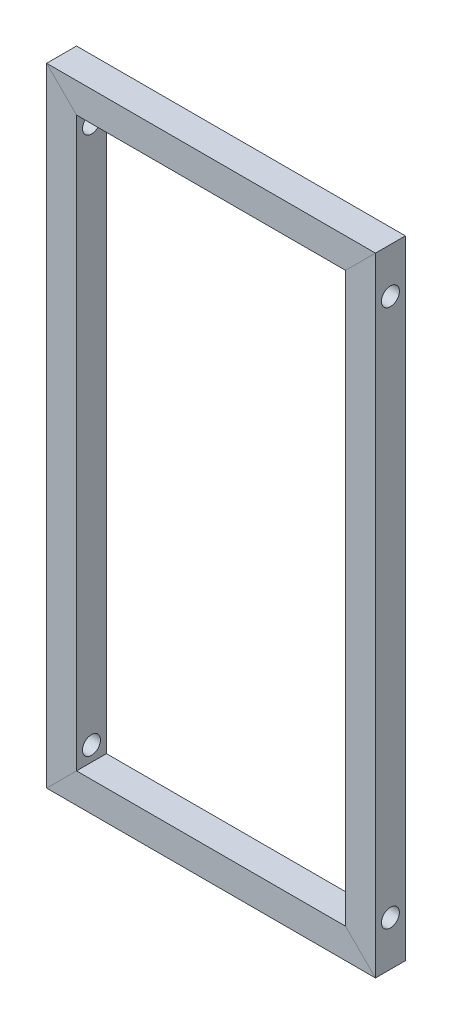
ISO-10303-21;
HEADER;
FILE_DESCRIPTION(('STEP AP214'),'2;1');
FILE_NAME('part.step','',(''),(''),'','','');
FILE_SCHEMA(('AUTOMOTIVE_DESIGN { 1 0 10303 214 1 1 1 1 }'));
ENDSEC;
DATA;
#1=APPLICATION_CONTEXT('core data for automotive mechanical design processes');
#2=APPLICATION_PROTOCOL_DEFINITION('international standard','automotive_design',2000,#1);
#3=PRODUCT_CONTEXT('',#1,'mechanical');
#4=PRODUCT('Part','Part','',(#3));
#5=PRODUCT_RELATED_PRODUCT_CATEGORY('part','',(#4));
#6=PRODUCT_DEFINITION_FORMATION('','',#4);
#7=PRODUCT_DEFINITION_CONTEXT('part definition',#1,'design');
#8=PRODUCT_DEFINITION('design','',#6,#7);
#9=PRODUCT_DEFINITION_SHAPE('','',#8);
#10=(LENGTH_UNIT() NAMED_UNIT(*) SI_UNIT(.MILLI.,.METRE.));
#11=(NAMED_UNIT(*) PLANE_ANGLE_UNIT() SI_UNIT($,.RADIAN.));
#12=(NAMED_UNIT(*) SI_UNIT($,.STERADIAN.) SOLID_ANGLE_UNIT());
#13=UNCERTAINTY_MEASURE_WITH_UNIT(LENGTH_MEASURE(1.E-05),#10,'distance_accuracy_value','');
#14=(GEOMETRIC_REPRESENTATION_CONTEXT(3) GLOBAL_UNCERTAINTY_ASSIGNED_CONTEXT((#13)) GLOBAL_UNIT_ASSIGNED_CONTEXT((#10,
#11,#12)) REPRESENTATION_CONTEXT('',''));
#15=CARTESIAN_POINT('',(0.,0.,0.));
#16=DIRECTION('',(0.,0.,1.));
#17=DIRECTION('',(1.,0.,0.));
#18=AXIS2_PLACEMENT_3D('',#15,#16,#17);
#19=CARTESIAN_POINT('',(5.4594,-10.414,0.253999999999999));
#20=DIRECTION('',(0.,-1.,0.));
#21=DIRECTION('',(0.,0.,-1.));
#22=AXIS2_PLACEMENT_3D('',#19,#20,#21);
#23=PLANE('',#22);
#24=DIRECTION('',(-1.,0.,0.));
#25=VECTOR('',#24,1.);
#26=CARTESIAN_POINT('',(5.4594,-10.414,0.253999999999999));
#27=LINE('',#26,#25);
#28=CARTESIAN_POINT('',(5.334,-10.414,0.253999999999999));
#29=VERTEX_POINT('',#28);
#30=CARTESIAN_POINT('',(-0.253999999999999,-10.414,0.253999999999999));
#31=VERTEX_POINT('',#30);
#32=EDGE_CURVE('E92',#29,#31,#27,.T.);
#33=ORIENTED_EDGE('',*,*,#32,.T.);
#34=DIRECTION('',(0.,0.,-1.));
#35=VECTOR('',#34,1.);
#36=CARTESIAN_POINT('',(-0.253999999999998,-10.414,0.253999999999999));
#37=LINE('',#36,#35);
#38=CARTESIAN_POINT('',(-0.253999999999999,-10.414,-0.254000000000001));
#39=VERTEX_POINT('',#38);
#40=EDGE_CURVE('E100',#31,#39,#37,.T.);
#41=ORIENTED_EDGE('',*,*,#40,.T.);
#42=DIRECTION('',(-1.,0.,0.));
#43=VECTOR('',#42,1.);
#44=CARTESIAN_POINT('',(5.4594,-10.414,-0.254000000000001));
#45=LINE('',#44,#43);
#46=CARTESIAN_POINT('',(5.334,-10.414,-0.254000000000001));
#47=VERTEX_POINT('',#46);
#48=EDGE_CURVE('E132',#47,#39,#45,.T.);
#49=ORIENTED_EDGE('',*,*,#48,.F.);
#50=DIRECTION('',(0.,0.,-1.));
#51=VECTOR('',#50,1.);
#52=CARTESIAN_POINT('',(5.334,-10.414,0.253999999999998));
#53=LINE('',#52,#51);
#54=EDGE_CURVE('E106',#29,#47,#53,.T.);
#55=ORIENTED_EDGE('',*,*,#54,.F.);
#56=EDGE_LOOP('',(#33,#41,#49,#55));
#57=FACE_BOUND('',#56,.T.);
#58=ADVANCED_FACE('F33',(#57),#23,.T.);
#59=CARTESIAN_POINT('',(5.4594,-10.414,-0.254000000000001));
#60=DIRECTION('',(0.,0.,-1.));
#61=DIRECTION('',(0.,1.,0.));
#62=AXIS2_PLACEMENT_3D('',#59,#60,#61);
#63=PLANE('',#62);
#64=ORIENTED_EDGE('',*,*,#48,.T.);
#65=DIRECTION('',(0.707106781186548,0.707106781186548,0.));
#66=VECTOR('',#65,1.);
#67=CARTESIAN_POINT('',(-0.316699999999998,-10.4767,-0.254000000000001));
#68=LINE('',#67,#66);
#69=CARTESIAN_POINT('',(0.254000000000002,-9.906,-0.254000000000001));
#70=VERTEX_POINT('',#69);
#71=EDGE_CURVE('E82',#39,#70,#68,.T.);
#72=ORIENTED_EDGE('',*,*,#71,.T.);
#73=DIRECTION('',(-1.,0.,0.));
#74=VECTOR('',#73,1.);
#75=CARTESIAN_POINT('',(5.4594,-9.906,-0.254000000000001));
#76=LINE('',#75,#74);
#77=CARTESIAN_POINT('',(4.826,-9.906,-0.254000000000001));
#78=VERTEX_POINT('',#77);
#79=EDGE_CURVE('E134',#78,#70,#76,.T.);
#80=ORIENTED_EDGE('',*,*,#79,.F.);
#81=DIRECTION('',(-0.707106781186548,0.707106781186548,0.));
#82=VECTOR('',#81,1.);
#83=CARTESIAN_POINT('',(-0.0626999999999989,-5.0173,-0.254));
#84=LINE('',#83,#82);
#85=EDGE_CURVE('E185',#47,#78,#84,.T.);
#86=ORIENTED_EDGE('',*,*,#85,.F.);
#87=EDGE_LOOP('',(#64,#72,#80,#86));
#88=FACE_BOUND('',#87,.T.);
#89=ADVANCED_FACE('F359',(#88),#63,.T.);
#90=CARTESIAN_POINT('',(5.4594,-9.906,0.253999999999999));
#91=DIRECTION('',(0.,1.,0.));
#92=DIRECTION('',(0.,0.,1.));
#93=AXIS2_PLACEMENT_3D('',#90,#91,#92);
#94=PLANE('',#93);
#95=ORIENTED_EDGE('',*,*,#79,.T.);
#96=DIRECTION('',(0.,0.,1.));
#97=VECTOR('',#96,1.);
#98=CARTESIAN_POINT('',(0.254000000000002,-9.906,0.253999999999999));
#99=LINE('',#98,#97);
#100=CARTESIAN_POINT('',(0.254000000000002,-9.906,0.253999999999999));
#101=VERTEX_POINT('',#100);
#102=EDGE_CURVE('E198',#70,#101,#99,.T.);
#103=ORIENTED_EDGE('',*,*,#102,.T.);
#104=DIRECTION('',(-1.,0.,0.));
#105=VECTOR('',#104,1.);
#106=CARTESIAN_POINT('',(5.4594,-9.906,0.253999999999999));
#107=LINE('',#106,#105);
#108=CARTESIAN_POINT('',(4.826,-9.906,0.253999999999999));
#109=VERTEX_POINT('',#108);
#110=EDGE_CURVE('E95',#109,#101,#107,.T.);
#111=ORIENTED_EDGE('',*,*,#110,.F.);
#112=DIRECTION('',(0.,0.,1.));
#113=VECTOR('',#112,1.);
#114=CARTESIAN_POINT('',(4.826,-9.906,0.253999999999998));
#115=LINE('',#114,#113);
#116=EDGE_CURVE('E175',#78,#109,#115,.T.);
#117=ORIENTED_EDGE('',*,*,#116,.F.);
#118=EDGE_LOOP('',(#95,#103,#111,#117));
#119=FACE_BOUND('',#118,.T.);
#120=ADVANCED_FACE('F353',(#119),#94,.T.);
#121=CARTESIAN_POINT('',(5.4594,-10.414,0.253999999999999));
#122=DIRECTION('',(0.,0.,1.));
#123=DIRECTION('',(0.,-1.,0.));
#124=AXIS2_PLACEMENT_3D('',#121,#122,#123);
#125=PLANE('',#124);
#126=ORIENTED_EDGE('',*,*,#110,.T.);
#127=DIRECTION('',(-0.707106781186548,-0.707106781186548,0.));
#128=VECTOR('',#127,1.);
#129=CARTESIAN_POINT('',(-0.316699999999998,-10.4767,0.253999999999999));
#130=LINE('',#129,#128);
#131=EDGE_CURVE('E89',#101,#31,#130,.T.);
#132=ORIENTED_EDGE('',*,*,#131,.T.);
#133=ORIENTED_EDGE('',*,*,#32,.F.);
#134=DIRECTION('',(0.707106781186548,-0.707106781186548,0.));
#135=VECTOR('',#134,1.);
#136=CARTESIAN_POINT('',(-0.0626999999999989,-5.0173,0.254));
#137=LINE('',#136,#135);
#138=EDGE_CURVE('E188',#109,#29,#137,.T.);
#139=ORIENTED_EDGE('',*,*,#138,.F.);
#140=EDGE_LOOP('',(#126,#132,#133,#139));
#141=FACE_BOUND('',#140,.T.);
#142=ADVANCED_FACE('F91',(#141),#125,.T.);
#143=CARTESIAN_POINT('',(-0.253999999999998,-10.5394,0.253999999999999));
#144=DIRECTION('',(-1.,0.,0.));
#145=DIRECTION('',(0.,0.,1.));
#146=AXIS2_PLACEMENT_3D('',#143,#144,#145);
#147=PLANE('',#146);
#148=CARTESIAN_POINT('',(-0.254,-9.652,0.));
#149=DIRECTION('',(-1.,0.,0.));
#150=DIRECTION('',(0.,0.,-1.));
#151=AXIS2_PLACEMENT_3D('',#148,#149,#150);
#152=CIRCLE('',#151,0.1524);
#153=CARTESIAN_POINT('',(-0.254,-9.652,-0.1524));
#154=VERTEX_POINT('',#153);
#155=EDGE_CURVE('E409',#154,#154,#152,.T.);
#156=ORIENTED_EDGE('',*,*,#155,.F.);
#157=EDGE_LOOP('',(#156));
#158=FACE_BOUND('',#157,.T.);
#159=CARTESIAN_POINT('',(-0.254,-0.508,0.));
#160=DIRECTION('',(1.,0.,0.));
#161=DIRECTION('',(0.,0.,-1.));
#162=AXIS2_PLACEMENT_3D('',#159,#160,#161);
#163=CIRCLE('',#162,0.1524);
#164=CARTESIAN_POINT('',(-0.254,-0.508,-0.1524));
#165=VERTEX_POINT('',#164);
#166=EDGE_CURVE('E139',#165,#165,#163,.T.);
#167=ORIENTED_EDGE('',*,*,#166,.T.);
#168=EDGE_LOOP('',(#167));
#169=FACE_BOUND('',#168,.T.);
#170=DIRECTION('',(0.,1.,0.));
#171=VECTOR('',#170,1.);
#172=CARTESIAN_POINT('',(-0.253999999999998,-10.5394,0.253999999999999));
#173=LINE('',#172,#171);
#174=CARTESIAN_POINT('',(-0.253999999999999,0.253999999999999,0.254));
#175=VERTEX_POINT('',#174);
#176=EDGE_CURVE('E113',#31,#175,#173,.T.);
#177=ORIENTED_EDGE('',*,*,#176,.T.);
#178=DIRECTION('',(0.,0.,-1.));
#179=VECTOR('',#178,1.);
#180=CARTESIAN_POINT('',(-0.254,0.254,0.254));
#181=LINE('',#180,#179);
#182=CARTESIAN_POINT('',(-0.253999999999999,0.253999999999999,-0.254));
#183=VERTEX_POINT('',#182);
#184=EDGE_CURVE('E169',#175,#183,#181,.T.);
#185=ORIENTED_EDGE('',*,*,#184,.T.);
#186=DIRECTION('',(0.,1.,0.));
#187=VECTOR('',#186,1.);
#188=CARTESIAN_POINT('',(-0.253999999999998,-10.5394,-0.254000000000001));
#189=LINE('',#188,#187);
#190=EDGE_CURVE('E116',#39,#183,#189,.T.);
#191=ORIENTED_EDGE('',*,*,#190,.F.);
#192=ORIENTED_EDGE('',*,*,#40,.F.);
#193=EDGE_LOOP('',(#177,#185,#191,#192));
#194=FACE_BOUND('',#193,.T.);
#195=ADVANCED_FACE('F111',(#158,#169,#194),#147,.T.);
#196=CARTESIAN_POINT('',(-0.253999999999998,-10.5394,-0.254000000000001));
#197=DIRECTION('',(0.,0.,-1.));
#198=DIRECTION('',(-1.,0.,0.));
#199=AXIS2_PLACEMENT_3D('',#196,#197,#198);
#200=PLANE('',#199);
#201=ORIENTED_EDGE('',*,*,#190,.T.);
#202=DIRECTION('',(0.707106781186548,-0.707106781186548,0.));
#203=VECTOR('',#202,1.);
#204=CARTESIAN_POINT('',(-0.3167,0.3167,-0.254));
#205=LINE('',#204,#203);
#206=CARTESIAN_POINT('',(0.254000000000001,-0.254,-0.254));
#207=VERTEX_POINT('',#206);
#208=EDGE_CURVE('E166',#183,#207,#205,.T.);
#209=ORIENTED_EDGE('',*,*,#208,.T.);
#210=DIRECTION('',(0.,1.,0.));
#211=VECTOR('',#210,1.);
#212=CARTESIAN_POINT('',(0.254000000000002,-10.5394,-0.254000000000001));
#213=LINE('',#212,#211);
#214=EDGE_CURVE('E128',#70,#207,#213,.T.);
#215=ORIENTED_EDGE('',*,*,#214,.F.);
#216=ORIENTED_EDGE('',*,*,#71,.F.);
#217=EDGE_LOOP('',(#201,#209,#215,#216));
#218=FACE_BOUND('',#217,.T.);
#219=ADVANCED_FACE('F238',(#218),#200,.T.);
#220=CARTESIAN_POINT('',(0.254000000000002,-10.5394,0.253999999999999));
#221=DIRECTION('',(1.,0.,0.));
#222=DIRECTION('',(0.,0.,-1.));
#223=AXIS2_PLACEMENT_3D('',#220,#221,#222);
#224=PLANE('',#223);
#225=CARTESIAN_POINT('',(0.254000000000002,-9.652,0.));
#226=DIRECTION('',(1.,0.,0.));
#227=DIRECTION('',(0.,0.,-1.));
#228=AXIS2_PLACEMENT_3D('',#225,#226,#227);
#229=CIRCLE('',#228,0.1524);
#230=CARTESIAN_POINT('',(0.254000000000002,-9.652,-0.1524));
#231=VERTEX_POINT('',#230);
#232=EDGE_CURVE('E150',#231,#231,#229,.F.);
#233=ORIENTED_EDGE('',*,*,#232,.T.);
#234=EDGE_LOOP('',(#233));
#235=FACE_BOUND('',#234,.T.);
#236=CARTESIAN_POINT('',(0.254000000000002,-0.508,0.));
#237=DIRECTION('',(1.,0.,0.));
#238=DIRECTION('',(0.,0.,-1.));
#239=AXIS2_PLACEMENT_3D('',#236,#237,#238);
#240=CIRCLE('',#239,0.1524);
#241=CARTESIAN_POINT('',(0.254000000000002,-0.508,-0.1524));
#242=VERTEX_POINT('',#241);
#243=EDGE_CURVE('E135',#242,#242,#240,.T.);
#244=ORIENTED_EDGE('',*,*,#243,.F.);
#245=EDGE_LOOP('',(#244));
#246=FACE_BOUND('',#245,.T.);
#247=ORIENTED_EDGE('',*,*,#214,.T.);
#248=DIRECTION('',(0.,0.,1.));
#249=VECTOR('',#248,1.);
#250=CARTESIAN_POINT('',(0.254,-0.254,0.254));
#251=LINE('',#250,#249);
#252=CARTESIAN_POINT('',(0.254000000000001,-0.254000000000001,0.254));
#253=VERTEX_POINT('',#252);
#254=EDGE_CURVE('E168',#207,#253,#251,.T.);
#255=ORIENTED_EDGE('',*,*,#254,.T.);
#256=DIRECTION('',(0.,1.,0.));
#257=VECTOR('',#256,1.);
#258=CARTESIAN_POINT('',(0.254000000000002,-10.5394,0.253999999999999));
#259=LINE('',#258,#257);
#260=EDGE_CURVE('E123',#101,#253,#259,.T.);
#261=ORIENTED_EDGE('',*,*,#260,.F.);
#262=ORIENTED_EDGE('',*,*,#102,.F.);
#263=EDGE_LOOP('',(#247,#255,#261,#262));
#264=FACE_BOUND('',#263,.T.);
#265=ADVANCED_FACE('F207',(#235,#246,#264),#224,.T.);
#266=CARTESIAN_POINT('',(-0.253999999999998,-10.5394,0.253999999999999));
#267=DIRECTION('',(0.,0.,1.));
#268=DIRECTION('',(1.,0.,0.));
#269=AXIS2_PLACEMENT_3D('',#266,#267,#268);
#270=PLANE('',#269);
#271=ORIENTED_EDGE('',*,*,#260,.T.);
#272=DIRECTION('',(-0.707106781186548,0.707106781186548,0.));
#273=VECTOR('',#272,1.);
#274=CARTESIAN_POINT('',(-0.3167,0.3167,0.254));
#275=LINE('',#274,#273);
#276=EDGE_CURVE('E121',#253,#175,#275,.T.);
#277=ORIENTED_EDGE('',*,*,#276,.T.);
#278=ORIENTED_EDGE('',*,*,#176,.F.);
#279=ORIENTED_EDGE('',*,*,#131,.F.);
#280=EDGE_LOOP('',(#271,#277,#278,#279));
#281=FACE_BOUND('',#280,.T.);
#282=ADVANCED_FACE('F119',(#281),#270,.T.);
#283=CARTESIAN_POINT('',(5.334,0.379399999999999,0.254));
#284=DIRECTION('',(1.,0.,0.));
#285=DIRECTION('',(0.,0.,-1.));
#286=AXIS2_PLACEMENT_3D('',#283,#284,#285);
#287=PLANE('',#286);
#288=CARTESIAN_POINT('',(5.334,-9.652,0.));
#289=DIRECTION('',(-1.,0.,0.));
#290=DIRECTION('',(0.,0.,-1.));
#291=AXIS2_PLACEMENT_3D('',#288,#289,#290);
#292=CIRCLE('',#291,0.1524);
#293=CARTESIAN_POINT('',(5.334,-9.652,-0.1524));
#294=VERTEX_POINT('',#293);
#295=EDGE_CURVE('E410',#294,#294,#292,.T.);
#296=ORIENTED_EDGE('',*,*,#295,.T.);
#297=EDGE_LOOP('',(#296));
#298=FACE_BOUND('',#297,.T.);
#299=CARTESIAN_POINT('',(5.334,-0.508,0.));
#300=DIRECTION('',(1.,0.,0.));
#301=DIRECTION('',(0.,0.,-1.));
#302=AXIS2_PLACEMENT_3D('',#299,#300,#301);
#303=CIRCLE('',#302,0.1524);
#304=CARTESIAN_POINT('',(5.334,-0.508,-0.1524));
#305=VERTEX_POINT('',#304);
#306=EDGE_CURVE('E145',#305,#305,#303,.T.);
#307=ORIENTED_EDGE('',*,*,#306,.F.);
#308=EDGE_LOOP('',(#307));
#309=FACE_BOUND('',#308,.T.);
#310=DIRECTION('',(0.,-1.,0.));
#311=VECTOR('',#310,1.);
#312=CARTESIAN_POINT('',(5.334,0.379399999999999,0.254));
#313=LINE('',#312,#311);
#314=CARTESIAN_POINT('',(5.334,0.254,0.254));
#315=VERTEX_POINT('',#314);
#316=EDGE_CURVE('E194',#315,#29,#313,.T.);
#317=ORIENTED_EDGE('',*,*,#316,.T.);
#318=ORIENTED_EDGE('',*,*,#54,.T.);
#319=DIRECTION('',(0.,-1.,0.));
#320=VECTOR('',#319,1.);
#321=CARTESIAN_POINT('',(5.334,0.379399999999999,-0.254));
#322=LINE('',#321,#320);
#323=CARTESIAN_POINT('',(5.334,0.254,-0.254));
#324=VERTEX_POINT('',#323);
#325=EDGE_CURVE('E122',#324,#47,#322,.T.);
#326=ORIENTED_EDGE('',*,*,#325,.F.);
#327=DIRECTION('',(0.,0.,-1.));
#328=VECTOR('',#327,1.);
#329=CARTESIAN_POINT('',(5.334,0.254,0.254));
#330=LINE('',#329,#328);
#331=EDGE_CURVE('E157',#315,#324,#330,.T.);
#332=ORIENTED_EDGE('',*,*,#331,.F.);
#333=EDGE_LOOP('',(#317,#318,#326,#332));
#334=FACE_BOUND('',#333,.T.);
#335=ADVANCED_FACE('F229',(#298,#309,#334),#287,.T.);
#336=CARTESIAN_POINT('',(5.334,0.379399999999999,-0.254));
#337=DIRECTION('',(0.,0.,-1.));
#338=DIRECTION('',(0.,1.,0.));
#339=AXIS2_PLACEMENT_3D('',#336,#337,#338);
#340=PLANE('',#339);
#341=ORIENTED_EDGE('',*,*,#325,.T.);
#342=ORIENTED_EDGE('',*,*,#85,.T.);
#343=DIRECTION('',(0.,-1.,0.));
#344=VECTOR('',#343,1.);
#345=CARTESIAN_POINT('',(4.826,0.379399999999999,-0.254));
#346=LINE('',#345,#344);
#347=CARTESIAN_POINT('',(4.826,-0.254,-0.254));
#348=VERTEX_POINT('',#347);
#349=EDGE_CURVE('E126',#348,#78,#346,.T.);
#350=ORIENTED_EDGE('',*,*,#349,.F.);
#351=DIRECTION('',(-0.707106781186548,-0.707106781186548,0.));
#352=VECTOR('',#351,1.);
#353=CARTESIAN_POINT('',(2.4773,-2.6027,-0.254));
#354=LINE('',#353,#352);
#355=EDGE_CURVE('E160',#324,#348,#354,.T.);
#356=ORIENTED_EDGE('',*,*,#355,.F.);
#357=EDGE_LOOP('',(#341,#342,#350,#356));
#358=FACE_BOUND('',#357,.T.);
#359=ADVANCED_FACE('F227',(#358),#340,.T.);
#360=CARTESIAN_POINT('',(4.826,0.379399999999999,0.254));
#361=DIRECTION('',(-1.,0.,0.));
#362=DIRECTION('',(0.,0.,1.));
#363=AXIS2_PLACEMENT_3D('',#360,#361,#362);
#364=PLANE('',#363);
#365=CARTESIAN_POINT('',(4.826,-9.652,0.));
#366=DIRECTION('',(-1.,0.,0.));
#367=DIRECTION('',(0.,0.,1.));
#368=AXIS2_PLACEMENT_3D('',#365,#366,#367);
#369=CIRCLE('',#368,0.1524);
#370=CARTESIAN_POINT('',(4.826,-9.652,0.1524));
#371=VERTEX_POINT('',#370);
#372=EDGE_CURVE('E36',#371,#371,#369,.F.);
#373=ORIENTED_EDGE('',*,*,#372,.T.);
#374=EDGE_LOOP('',(#373));
#375=FACE_BOUND('',#374,.T.);
#376=CARTESIAN_POINT('',(4.826,-0.508,0.));
#377=DIRECTION('',(-1.,0.,0.));
#378=DIRECTION('',(0.,0.,1.));
#379=AXIS2_PLACEMENT_3D('',#376,#377,#378);
#380=CIRCLE('',#379,0.1524);
#381=CARTESIAN_POINT('',(4.826,-0.508,0.1524));
#382=VERTEX_POINT('',#381);
#383=EDGE_CURVE('E137',#382,#382,#380,.T.);
#384=ORIENTED_EDGE('',*,*,#383,.F.);
#385=EDGE_LOOP('',(#384));
#386=FACE_BOUND('',#385,.T.);
#387=ORIENTED_EDGE('',*,*,#349,.T.);
#388=ORIENTED_EDGE('',*,*,#116,.T.);
#389=DIRECTION('',(0.,-1.,0.));
#390=VECTOR('',#389,1.);
#391=CARTESIAN_POINT('',(4.826,0.379399999999999,0.254));
#392=LINE('',#391,#390);
#393=CARTESIAN_POINT('',(4.826,-0.254,0.254));
#394=VERTEX_POINT('',#393);
#395=EDGE_CURVE('E192',#394,#109,#392,.T.);
#396=ORIENTED_EDGE('',*,*,#395,.F.);
#397=DIRECTION('',(0.,0.,1.));
#398=VECTOR('',#397,1.);
#399=CARTESIAN_POINT('',(4.826,-0.254,0.254));
#400=LINE('',#399,#398);
#401=EDGE_CURVE('E163',#348,#394,#400,.T.);
#402=ORIENTED_EDGE('',*,*,#401,.F.);
#403=EDGE_LOOP('',(#387,#388,#396,#402));
#404=FACE_BOUND('',#403,.T.);
#405=ADVANCED_FACE('F266',(#375,#386,#404),#364,.T.);
#406=CARTESIAN_POINT('',(5.334,0.379399999999999,0.254));
#407=DIRECTION('',(0.,0.,1.));
#408=DIRECTION('',(0.,-1.,0.));
#409=AXIS2_PLACEMENT_3D('',#406,#407,#408);
#410=PLANE('',#409);
#411=ORIENTED_EDGE('',*,*,#395,.T.);
#412=ORIENTED_EDGE('',*,*,#138,.T.);
#413=ORIENTED_EDGE('',*,*,#316,.F.);
#414=DIRECTION('',(0.707106781186548,0.707106781186548,0.));
#415=VECTOR('',#414,1.);
#416=CARTESIAN_POINT('',(2.4773,-2.6027,0.254));
#417=LINE('',#416,#415);
#418=EDGE_CURVE('E51',#394,#315,#417,.T.);
#419=ORIENTED_EDGE('',*,*,#418,.F.);
#420=EDGE_LOOP('',(#411,#412,#413,#419));
#421=FACE_BOUND('',#420,.T.);
#422=ADVANCED_FACE('F263',(#421),#410,.T.);
#423=CARTESIAN_POINT('',(-0.3794,0.254,0.254));
#424=DIRECTION('',(0.,1.,0.));
#425=DIRECTION('',(0.,0.,1.));
#426=AXIS2_PLACEMENT_3D('',#423,#424,#425);
#427=PLANE('',#426);
#428=ORIENTED_EDGE('',*,*,#184,.F.);
#429=DIRECTION('',(1.,0.,0.));
#430=VECTOR('',#429,1.);
#431=CARTESIAN_POINT('',(-0.3794,0.254,0.254));
#432=LINE('',#431,#430);
#433=EDGE_CURVE('E11',#175,#315,#432,.T.);
#434=ORIENTED_EDGE('',*,*,#433,.T.);
#435=ORIENTED_EDGE('',*,*,#331,.T.);
#436=DIRECTION('',(1.,0.,0.));
#437=VECTOR('',#436,1.);
#438=CARTESIAN_POINT('',(-0.3794,0.254,-0.254));
#439=LINE('',#438,#437);
#440=EDGE_CURVE('E156',#183,#324,#439,.T.);
#441=ORIENTED_EDGE('',*,*,#440,.F.);
#442=EDGE_LOOP('',(#428,#434,#435,#441));
#443=FACE_BOUND('',#442,.T.);
#444=ADVANCED_FACE('F231',(#443),#427,.T.);
#445=CARTESIAN_POINT('',(-0.3794,0.254,-0.254));
#446=DIRECTION('',(0.,0.,-1.));
#447=DIRECTION('',(-1.,0.,0.));
#448=AXIS2_PLACEMENT_3D('',#445,#446,#447);
#449=PLANE('',#448);
#450=ORIENTED_EDGE('',*,*,#208,.F.);
#451=ORIENTED_EDGE('',*,*,#440,.T.);
#452=ORIENTED_EDGE('',*,*,#355,.T.);
#453=DIRECTION('',(1.,0.,0.));
#454=VECTOR('',#453,1.);
#455=CARTESIAN_POINT('',(-0.3794,-0.254,-0.254));
#456=LINE('',#455,#454);
#457=EDGE_CURVE('E178',#207,#348,#456,.T.);
#458=ORIENTED_EDGE('',*,*,#457,.F.);
#459=EDGE_LOOP('',(#450,#451,#452,#458));
#460=FACE_BOUND('',#459,.T.);
#461=ADVANCED_FACE('F219',(#460),#449,.T.);
#462=CARTESIAN_POINT('',(-0.3794,-0.254,0.254));
#463=DIRECTION('',(0.,-1.,0.));
#464=DIRECTION('',(0.,0.,-1.));
#465=AXIS2_PLACEMENT_3D('',#462,#463,#464);
#466=PLANE('',#465);
#467=ORIENTED_EDGE('',*,*,#254,.F.);
#468=ORIENTED_EDGE('',*,*,#457,.T.);
#469=ORIENTED_EDGE('',*,*,#401,.T.);
#470=DIRECTION('',(1.,0.,0.));
#471=VECTOR('',#470,1.);
#472=CARTESIAN_POINT('',(-0.3794,-0.254,0.254));
#473=LINE('',#472,#471);
#474=EDGE_CURVE('E42',#253,#394,#473,.T.);
#475=ORIENTED_EDGE('',*,*,#474,.F.);
#476=EDGE_LOOP('',(#467,#468,#469,#475));
#477=FACE_BOUND('',#476,.T.);
#478=ADVANCED_FACE('F215',(#477),#466,.T.);
#479=CARTESIAN_POINT('',(-0.3794,0.254,0.254));
#480=DIRECTION('',(0.,0.,1.));
#481=DIRECTION('',(1.,0.,0.));
#482=AXIS2_PLACEMENT_3D('',#479,#480,#481);
#483=PLANE('',#482);
#484=ORIENTED_EDGE('',*,*,#276,.F.);
#485=ORIENTED_EDGE('',*,*,#474,.T.);
#486=ORIENTED_EDGE('',*,*,#418,.T.);
#487=ORIENTED_EDGE('',*,*,#433,.F.);
#488=EDGE_LOOP('',(#484,#485,#486,#487));
#489=FACE_BOUND('',#488,.T.);
#490=ADVANCED_FACE('F234',(#489),#483,.T.);
#491=CARTESIAN_POINT('',(-0.254,-0.508,0.));
#492=DIRECTION('',(1.,0.,0.));
#493=DIRECTION('',(0.,0.,-1.));
#494=AXIS2_PLACEMENT_3D('',#491,#492,#493);
#495=CYLINDRICAL_SURFACE('',#494,0.1524);
#496=ORIENTED_EDGE('',*,*,#383,.T.);
#497=EDGE_LOOP('',(#496));
#498=FACE_BOUND('',#497,.T.);
#499=ORIENTED_EDGE('',*,*,#306,.T.);
#500=EDGE_LOOP('',(#499));
#501=FACE_BOUND('',#500,.T.);
#502=ADVANCED_FACE('F252',(#498,#501),#495,.F.);
#503=ORIENTED_EDGE('',*,*,#243,.T.);
#504=EDGE_LOOP('',(#503));
#505=FACE_BOUND('',#504,.T.);
#506=ORIENTED_EDGE('',*,*,#166,.F.);
#507=EDGE_LOOP('',(#506));
#508=FACE_BOUND('',#507,.T.);
#509=ADVANCED_FACE('F258',(#505,#508),#495,.F.);
#510=CARTESIAN_POINT('',(-0.254,-9.652,0.));
#511=DIRECTION('',(1.,0.,0.));
#512=DIRECTION('',(0.,0.,-1.));
#513=AXIS2_PLACEMENT_3D('',#510,#511,#512);
#514=CYLINDRICAL_SURFACE('',#513,0.1524);
#515=ORIENTED_EDGE('',*,*,#372,.F.);
#516=EDGE_LOOP('',(#515));
#517=FACE_BOUND('',#516,.T.);
#518=ORIENTED_EDGE('',*,*,#295,.F.);
#519=EDGE_LOOP('',(#518));
#520=FACE_BOUND('',#519,.T.);
#521=ADVANCED_FACE('F334',(#517,#520),#514,.F.);
#522=ORIENTED_EDGE('',*,*,#232,.F.);
#523=EDGE_LOOP('',(#522));
#524=FACE_BOUND('',#523,.T.);
#525=ORIENTED_EDGE('',*,*,#155,.T.);
#526=EDGE_LOOP('',(#525));
#527=FACE_BOUND('',#526,.T.);
#528=ADVANCED_FACE('F391',(#524,#527),#514,.F.);
#529=CLOSED_SHELL('',(#58,#89,#120,#142,#195,#219,#265,#282,#335,#359,#405,#422,#444,#461,#478,
#490,#502,#509,#521,#528));
#530=MANIFOLD_SOLID_BREP('B2',#529);
#531=ADVANCED_BREP_SHAPE_REPRESENTATION('',(#18,#530),#14);
#532=SHAPE_DEFINITION_REPRESENTATION(#9,#531);
ENDSEC;
END-ISO-10303-21;
